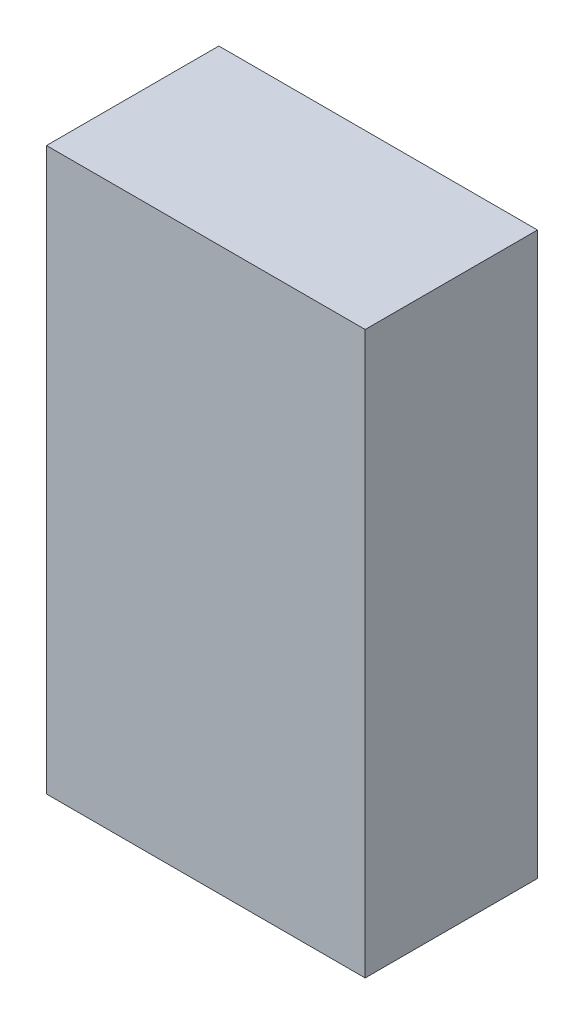
ISO-10303-21;
HEADER;
FILE_DESCRIPTION(('STEP AP214'),'2;1');
FILE_NAME('part.step','',(''),(''),'','','');
FILE_SCHEMA(('AUTOMOTIVE_DESIGN { 1 0 10303 214 1 1 1 1 }'));
ENDSEC;
DATA;
#1=APPLICATION_CONTEXT('core data for automotive mechanical design processes');
#2=APPLICATION_PROTOCOL_DEFINITION('international standard','automotive_design',2000,#1);
#3=PRODUCT_CONTEXT('',#1,'mechanical');
#4=PRODUCT('Part','Part','',(#3));
#5=PRODUCT_RELATED_PRODUCT_CATEGORY('part','',(#4));
#6=PRODUCT_DEFINITION_FORMATION('','',#4);
#7=PRODUCT_DEFINITION_CONTEXT('part definition',#1,'design');
#8=PRODUCT_DEFINITION('design','',#6,#7);
#9=PRODUCT_DEFINITION_SHAPE('','',#8);
#10=(LENGTH_UNIT() NAMED_UNIT(*) SI_UNIT(.MILLI.,.METRE.));
#11=(NAMED_UNIT(*) PLANE_ANGLE_UNIT() SI_UNIT($,.RADIAN.));
#12=(NAMED_UNIT(*) SI_UNIT($,.STERADIAN.) SOLID_ANGLE_UNIT());
#13=UNCERTAINTY_MEASURE_WITH_UNIT(LENGTH_MEASURE(1.E-05),#10,'distance_accuracy_value','');
#14=(GEOMETRIC_REPRESENTATION_CONTEXT(3) GLOBAL_UNCERTAINTY_ASSIGNED_CONTEXT((#13)) GLOBAL_UNIT_ASSIGNED_CONTEXT((#10,
#11,#12)) REPRESENTATION_CONTEXT('',''));
#15=CARTESIAN_POINT('',(0.,0.,0.));
#16=DIRECTION('',(0.,0.,1.));
#17=DIRECTION('',(1.,0.,0.));
#18=AXIS2_PLACEMENT_3D('',#15,#16,#17);
#19=CARTESIAN_POINT('',(-281.686,52.5973680774712,-153.963811272511));
#20=DIRECTION('',(0.,0.,-1.));
#21=DIRECTION('',(-1.,0.,0.));
#22=AXIS2_PLACEMENT_3D('',#19,#20,#21);
#23=PLANE('',#22);
#24=DIRECTION('',(1.,0.,0.));
#25=VECTOR('',#24,1.);
#26=CARTESIAN_POINT('',(-281.686,52.5973680774712,-153.963811272511));
#27=LINE('',#26,#25);
#28=CARTESIAN_POINT('',(-281.686,52.5973680774712,-153.963811272511));
#29=VERTEX_POINT('',#28);
#30=CARTESIAN_POINT('',(2.99999999999997,52.5973680774712,-153.963811272511));
#31=VERTEX_POINT('',#30);
#32=EDGE_CURVE('E66',#29,#31,#27,.T.);
#33=ORIENTED_EDGE('',*,*,#32,.T.);
#34=DIRECTION('',(0.,1.,0.));
#35=VECTOR('',#34,1.);
#36=CARTESIAN_POINT('',(2.99999999999997,-449.146133410196,-153.963811272511));
#37=LINE('',#36,#35);
#38=CARTESIAN_POINT('',(2.99999999999997,-449.146133410196,-153.963811272511));
#39=VERTEX_POINT('',#38);
#40=EDGE_CURVE('E41',#39,#31,#37,.T.);
#41=ORIENTED_EDGE('',*,*,#40,.F.);
#42=DIRECTION('',(1.,0.,0.));
#43=VECTOR('',#42,1.);
#44=CARTESIAN_POINT('',(-281.686,-449.146133410196,-153.963811272511));
#45=LINE('',#44,#43);
#46=CARTESIAN_POINT('',(-281.686,-449.146133410196,-153.963811272511));
#47=VERTEX_POINT('',#46);
#48=EDGE_CURVE('E96',#47,#39,#45,.T.);
#49=ORIENTED_EDGE('',*,*,#48,.F.);
#50=DIRECTION('',(0.,1.,0.));
#51=VECTOR('',#50,1.);
#52=CARTESIAN_POINT('',(-281.686,52.5973680774712,-153.963811272511));
#53=LINE('',#52,#51);
#54=EDGE_CURVE('E68',#47,#29,#53,.T.);
#55=ORIENTED_EDGE('',*,*,#54,.T.);
#56=EDGE_LOOP('',(#33,#41,#49,#55));
#57=FACE_BOUND('',#56,.T.);
#58=ADVANCED_FACE('F33',(#57),#23,.T.);
#59=CARTESIAN_POINT('',(0.,0.,0.));
#60=DIRECTION('',(0.,0.,-1.));
#61=DIRECTION('',(-1.,0.,0.));
#62=AXIS2_PLACEMENT_3D('',#59,#60,#61);
#63=PLANE('',#62);
#64=DIRECTION('',(0.,1.,0.));
#65=VECTOR('',#64,1.);
#66=CARTESIAN_POINT('',(2.99999999999997,52.5973680774712,0.));
#67=LINE('',#66,#65);
#68=CARTESIAN_POINT('',(2.99999999999997,-449.146133410196,0.));
#69=VERTEX_POINT('',#68);
#70=CARTESIAN_POINT('',(2.99999999999997,52.5973680774712,0.));
#71=VERTEX_POINT('',#70);
#72=EDGE_CURVE('E86',#69,#71,#67,.T.);
#73=ORIENTED_EDGE('',*,*,#72,.T.);
#74=DIRECTION('',(-1.,0.,0.));
#75=VECTOR('',#74,1.);
#76=CARTESIAN_POINT('',(2.99999999999997,52.5973680774712,0.));
#77=LINE('',#76,#75);
#78=CARTESIAN_POINT('',(-281.686,52.5973680774712,0.));
#79=VERTEX_POINT('',#78);
#80=EDGE_CURVE('E79',#71,#79,#77,.T.);
#81=ORIENTED_EDGE('',*,*,#80,.T.);
#82=DIRECTION('',(0.,-1.,0.));
#83=VECTOR('',#82,1.);
#84=CARTESIAN_POINT('',(-281.686,52.5973680774712,0.));
#85=LINE('',#84,#83);
#86=CARTESIAN_POINT('',(-281.686,-449.146133410196,0.));
#87=VERTEX_POINT('',#86);
#88=EDGE_CURVE('E85',#79,#87,#85,.T.);
#89=ORIENTED_EDGE('',*,*,#88,.T.);
#90=DIRECTION('',(1.,0.,0.));
#91=VECTOR('',#90,1.);
#92=CARTESIAN_POINT('',(2.99999999999997,-449.146133410196,0.));
#93=LINE('',#92,#91);
#94=EDGE_CURVE('E91',#87,#69,#93,.T.);
#95=ORIENTED_EDGE('',*,*,#94,.T.);
#96=EDGE_LOOP('',(#73,#81,#89,#95));
#97=FACE_BOUND('',#96,.T.);
#98=ADVANCED_FACE('F89',(#97),#63,.F.);
#99=CARTESIAN_POINT('',(2.99999999999997,52.5973680774712,-730.845653490746));
#100=DIRECTION('',(0.,1.,0.));
#101=DIRECTION('',(0.,0.,1.));
#102=AXIS2_PLACEMENT_3D('',#99,#100,#101);
#103=PLANE('',#102);
#104=DIRECTION('',(0.,0.,1.));
#105=VECTOR('',#104,1.);
#106=CARTESIAN_POINT('',(2.99999999999997,52.5973680774712,-730.845653490746));
#107=LINE('',#106,#105);
#108=EDGE_CURVE('E11',#31,#71,#107,.T.);
#109=ORIENTED_EDGE('',*,*,#108,.F.);
#110=ORIENTED_EDGE('',*,*,#32,.F.);
#111=DIRECTION('',(0.,0.,1.));
#112=VECTOR('',#111,1.);
#113=CARTESIAN_POINT('',(-281.686,52.5973680774712,-730.845653490746));
#114=LINE('',#113,#112);
#115=EDGE_CURVE('E81',#29,#79,#114,.T.);
#116=ORIENTED_EDGE('',*,*,#115,.T.);
#117=ORIENTED_EDGE('',*,*,#80,.F.);
#118=EDGE_LOOP('',(#109,#110,#116,#117));
#119=FACE_BOUND('',#118,.T.);
#120=ADVANCED_FACE('F77',(#119),#103,.T.);
#121=CARTESIAN_POINT('',(-281.686,52.5973680774712,-730.845653490746));
#122=DIRECTION('',(-1.,0.,0.));
#123=DIRECTION('',(0.,0.,1.));
#124=AXIS2_PLACEMENT_3D('',#121,#122,#123);
#125=PLANE('',#124);
#126=ORIENTED_EDGE('',*,*,#115,.F.);
#127=ORIENTED_EDGE('',*,*,#54,.F.);
#128=DIRECTION('',(0.,0.,1.));
#129=VECTOR('',#128,1.);
#130=CARTESIAN_POINT('',(-281.686,-449.146133410196,-730.845653490746));
#131=LINE('',#130,#129);
#132=EDGE_CURVE('E97',#47,#87,#131,.T.);
#133=ORIENTED_EDGE('',*,*,#132,.T.);
#134=ORIENTED_EDGE('',*,*,#88,.F.);
#135=EDGE_LOOP('',(#126,#127,#133,#134));
#136=FACE_BOUND('',#135,.T.);
#137=ADVANCED_FACE('F106',(#136),#125,.T.);
#138=CARTESIAN_POINT('',(2.99999999999997,-449.146133410196,-730.845653490746));
#139=DIRECTION('',(0.,-1.,0.));
#140=DIRECTION('',(0.,0.,-1.));
#141=AXIS2_PLACEMENT_3D('',#138,#139,#140);
#142=PLANE('',#141);
#143=ORIENTED_EDGE('',*,*,#132,.F.);
#144=ORIENTED_EDGE('',*,*,#48,.T.);
#145=DIRECTION('',(0.,0.,1.));
#146=VECTOR('',#145,1.);
#147=CARTESIAN_POINT('',(2.99999999999997,-449.146133410196,-730.845653490746));
#148=LINE('',#147,#146);
#149=EDGE_CURVE('E74',#39,#69,#148,.T.);
#150=ORIENTED_EDGE('',*,*,#149,.T.);
#151=ORIENTED_EDGE('',*,*,#94,.F.);
#152=EDGE_LOOP('',(#143,#144,#150,#151));
#153=FACE_BOUND('',#152,.T.);
#154=ADVANCED_FACE('F105',(#153),#142,.T.);
#155=CARTESIAN_POINT('',(2.99999999999997,52.5973680774712,-730.845653490746));
#156=DIRECTION('',(1.,0.,0.));
#157=DIRECTION('',(0.,0.,-1.));
#158=AXIS2_PLACEMENT_3D('',#155,#156,#157);
#159=PLANE('',#158);
#160=ORIENTED_EDGE('',*,*,#149,.F.);
#161=ORIENTED_EDGE('',*,*,#40,.T.);
#162=ORIENTED_EDGE('',*,*,#108,.T.);
#163=ORIENTED_EDGE('',*,*,#72,.F.);
#164=EDGE_LOOP('',(#160,#161,#162,#163));
#165=FACE_BOUND('',#164,.T.);
#166=ADVANCED_FACE('F73',(#165),#159,.T.);
#167=CLOSED_SHELL('',(#58,#98,#120,#137,#154,#166));
#168=MANIFOLD_SOLID_BREP('B2',#167);
#169=ADVANCED_BREP_SHAPE_REPRESENTATION('',(#18,#168),#14);
#170=SHAPE_DEFINITION_REPRESENTATION(#9,#169);
ENDSEC;
END-ISO-10303-21;
